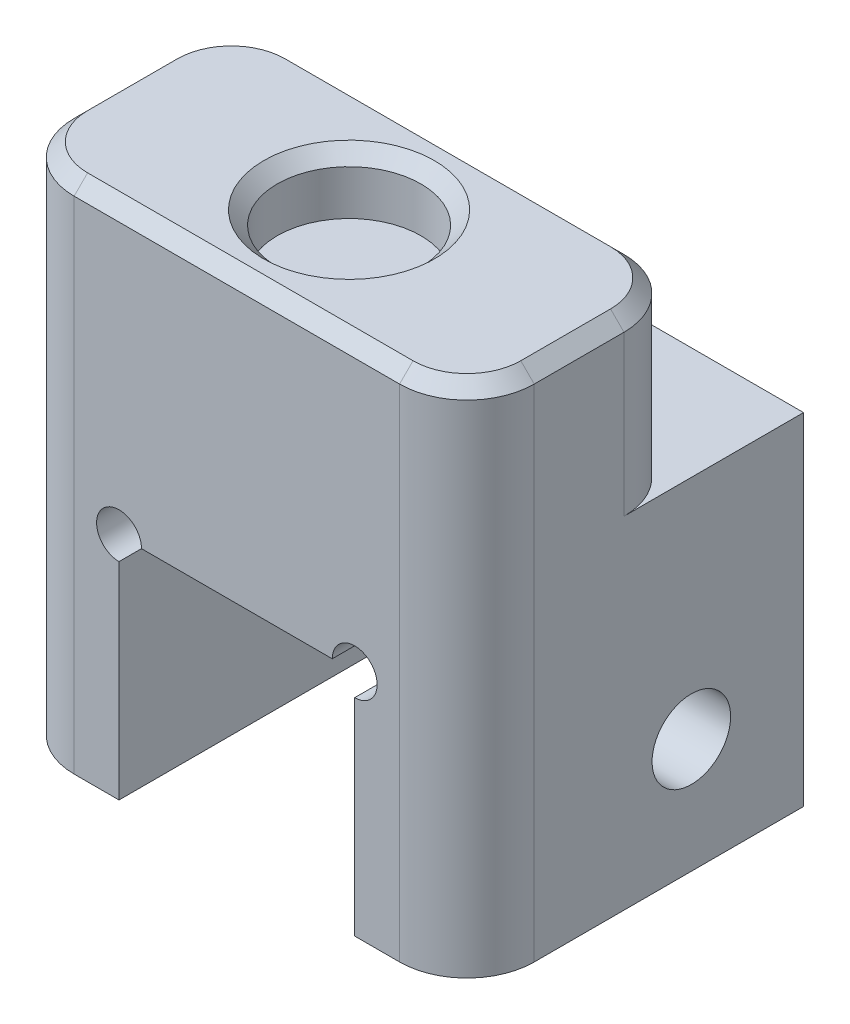
ISO-10303-21;
HEADER;
FILE_DESCRIPTION(('STEP AP214'),'2;1');
FILE_NAME('part.step','',(''),(''),'','','');
FILE_SCHEMA(('AUTOMOTIVE_DESIGN { 1 0 10303 214 1 1 1 1 }'));
ENDSEC;
DATA;
#1=APPLICATION_CONTEXT('core data for automotive mechanical design processes');
#2=APPLICATION_PROTOCOL_DEFINITION('international standard','automotive_design',2000,#1);
#3=PRODUCT_CONTEXT('',#1,'mechanical');
#4=PRODUCT('Part','Part','',(#3));
#5=PRODUCT_RELATED_PRODUCT_CATEGORY('part','',(#4));
#6=PRODUCT_DEFINITION_FORMATION('','',#4);
#7=PRODUCT_DEFINITION_CONTEXT('part definition',#1,'design');
#8=PRODUCT_DEFINITION('design','',#6,#7);
#9=PRODUCT_DEFINITION_SHAPE('','',#8);
#10=(LENGTH_UNIT() NAMED_UNIT(*) SI_UNIT(.MILLI.,.METRE.));
#11=(NAMED_UNIT(*) PLANE_ANGLE_UNIT() SI_UNIT($,.RADIAN.));
#12=(NAMED_UNIT(*) SI_UNIT($,.STERADIAN.) SOLID_ANGLE_UNIT());
#13=UNCERTAINTY_MEASURE_WITH_UNIT(LENGTH_MEASURE(1.E-05),#10,'distance_accuracy_value','');
#14=(GEOMETRIC_REPRESENTATION_CONTEXT(3) GLOBAL_UNCERTAINTY_ASSIGNED_CONTEXT((#13)) GLOBAL_UNIT_ASSIGNED_CONTEXT((#10,
#11,#12)) REPRESENTATION_CONTEXT('',''));
#15=CARTESIAN_POINT('',(0.,0.,0.));
#16=DIRECTION('',(0.,0.,1.));
#17=DIRECTION('',(1.,0.,0.));
#18=AXIS2_PLACEMENT_3D('',#15,#16,#17);
#19=CARTESIAN_POINT('',(0.,0.,0.));
#20=DIRECTION('',(0.,0.,1.));
#21=DIRECTION('',(1.,0.,0.));
#22=AXIS2_PLACEMENT_3D('',#19,#20,#21);
#23=PLANE('',#22);
#24=DIRECTION('',(0.,1.,0.));
#25=VECTOR('',#24,1.);
#26=CARTESIAN_POINT('',(-7.25000000000001,11.45,0.));
#27=LINE('',#26,#25);
#28=CARTESIAN_POINT('',(-7.25000000000001,3.75000000000001,0.));
#29=VERTEX_POINT('',#28);
#30=CARTESIAN_POINT('',(-7.25000000000001,10.85,0.));
#31=VERTEX_POINT('',#30);
#32=EDGE_CURVE('E286',#29,#31,#27,.T.);
#33=ORIENTED_EDGE('',*,*,#32,.T.);
#34=DIRECTION('',(1.,0.,0.));
#35=VECTOR('',#34,1.);
#36=CARTESIAN_POINT('',(7.25000000000001,10.85,0.));
#37=LINE('',#36,#35);
#38=CARTESIAN_POINT('',(7.25000000000001,10.85,0.));
#39=VERTEX_POINT('',#38);
#40=EDGE_CURVE('E54',#31,#39,#37,.T.);
#41=ORIENTED_EDGE('',*,*,#40,.T.);
#42=DIRECTION('',(0.,1.,0.));
#43=VECTOR('',#42,1.);
#44=CARTESIAN_POINT('',(7.25000000000001,0.,0.));
#45=LINE('',#44,#43);
#46=CARTESIAN_POINT('',(7.25000000000001,3.75000000000001,0.));
#47=VERTEX_POINT('',#46);
#48=EDGE_CURVE('E277',#39,#47,#45,.F.);
#49=ORIENTED_EDGE('',*,*,#48,.T.);
#50=DIRECTION('',(1.,0.,0.));
#51=VECTOR('',#50,1.);
#52=CARTESIAN_POINT('',(10.25,3.75,0.));
#53=LINE('',#52,#51);
#54=EDGE_CURVE('E236',#29,#47,#53,.T.);
#55=ORIENTED_EDGE('',*,*,#54,.F.);
#56=EDGE_LOOP('',(#33,#41,#49,#55));
#57=FACE_BOUND('',#56,.T.);
#58=ADVANCED_FACE('F43',(#57),#23,.F.);
#59=CARTESIAN_POINT('',(0.,-1.24999999999999,10.));
#60=DIRECTION('',(0.,1.,0.));
#61=DIRECTION('',(0.,0.,1.));
#62=AXIS2_PLACEMENT_3D('',#59,#60,#61);
#63=PLANE('',#62);
#64=DIRECTION('',(-1.,0.,0.));
#65=VECTOR('',#64,1.);
#66=CARTESIAN_POINT('',(-5.25,-1.24999999999999,-5.));
#67=LINE('',#66,#65);
#68=CARTESIAN_POINT('',(4.25000000000001,-1.24999999999999,-5.));
#69=VERTEX_POINT('',#68);
#70=CARTESIAN_POINT('',(-4.24999999999999,-1.24999999999999,-5.));
#71=VERTEX_POINT('',#70);
#72=EDGE_CURVE('E204',#69,#71,#67,.T.);
#73=ORIENTED_EDGE('',*,*,#72,.F.);
#74=DIRECTION('',(0.,0.,1.));
#75=VECTOR('',#74,1.);
#76=CARTESIAN_POINT('',(4.25000000000001,-1.24999999999999,-5.));
#77=LINE('',#76,#75);
#78=CARTESIAN_POINT('',(4.25000000000001,-1.24999999999999,10.));
#79=VERTEX_POINT('',#78);
#80=EDGE_CURVE('E428',#69,#79,#77,.T.);
#81=ORIENTED_EDGE('',*,*,#80,.T.);
#82=DIRECTION('',(1.,0.,0.));
#83=VECTOR('',#82,1.);
#84=CARTESIAN_POINT('',(0.,-1.24999999999999,10.));
#85=LINE('',#84,#83);
#86=CARTESIAN_POINT('',(-4.24999999999999,-1.24999999999999,10.));
#87=VERTEX_POINT('',#86);
#88=EDGE_CURVE('E206',#87,#79,#85,.T.);
#89=ORIENTED_EDGE('',*,*,#88,.F.);
#90=DIRECTION('',(0.,0.,1.));
#91=VECTOR('',#90,1.);
#92=CARTESIAN_POINT('',(-4.24999999999999,-1.24999999999999,-5.));
#93=LINE('',#92,#91);
#94=EDGE_CURVE('E188',#87,#71,#93,.F.);
#95=ORIENTED_EDGE('',*,*,#94,.T.);
#96=EDGE_LOOP('',(#73,#81,#89,#95));
#97=FACE_BOUND('',#96,.T.);
#98=ADVANCED_FACE('F202',(#97),#63,.F.);
#99=CARTESIAN_POINT('',(5.25000000000001,0.,10.));
#100=DIRECTION('',(1.,0.,0.));
#101=DIRECTION('',(0.,1.,0.));
#102=AXIS2_PLACEMENT_3D('',#99,#100,#101);
#103=PLANE('',#102);
#104=CARTESIAN_POINT('',(5.25000000000001,-6.34999999999999,0.));
#105=DIRECTION('',(1.,0.,0.));
#106=DIRECTION('',(0.,1.,0.));
#107=AXIS2_PLACEMENT_3D('',#104,#105,#106);
#108=CIRCLE('',#107,1.75);
#109=CARTESIAN_POINT('',(5.25000000000001,-4.59999999999999,0.));
#110=VERTEX_POINT('',#109);
#111=EDGE_CURVE('E282',#110,#110,#108,.T.);
#112=ORIENTED_EDGE('',*,*,#111,.T.);
#113=EDGE_LOOP('',(#112));
#114=FACE_BOUND('',#113,.T.);
#115=DIRECTION('',(0.,-1.,0.));
#116=VECTOR('',#115,1.);
#117=CARTESIAN_POINT('',(5.25000000000001,0.,10.));
#118=LINE('',#117,#116);
#119=CARTESIAN_POINT('',(5.25000000000001,-2.24999999999999,10.));
#120=VERTEX_POINT('',#119);
#121=CARTESIAN_POINT('',(5.25000000000001,-11.45,10.));
#122=VERTEX_POINT('',#121);
#123=EDGE_CURVE('E250',#120,#122,#118,.T.);
#124=ORIENTED_EDGE('',*,*,#123,.F.);
#125=DIRECTION('',(0.,0.,1.));
#126=VECTOR('',#125,1.);
#127=CARTESIAN_POINT('',(5.25000000000001,-2.24999999999999,-5.));
#128=LINE('',#127,#126);
#129=CARTESIAN_POINT('',(5.25000000000001,-2.24999999999999,-5.));
#130=VERTEX_POINT('',#129);
#131=EDGE_CURVE('E208',#120,#130,#128,.F.);
#132=ORIENTED_EDGE('',*,*,#131,.T.);
#133=DIRECTION('',(0.,1.,0.));
#134=VECTOR('',#133,1.);
#135=CARTESIAN_POINT('',(5.25000000000001,-1.24999999999999,-5.));
#136=LINE('',#135,#134);
#137=CARTESIAN_POINT('',(5.25000000000001,-11.45,-5.));
#138=VERTEX_POINT('',#137);
#139=EDGE_CURVE('E216',#138,#130,#136,.T.);
#140=ORIENTED_EDGE('',*,*,#139,.F.);
#141=DIRECTION('',(0.,0.,-1.));
#142=VECTOR('',#141,1.);
#143=CARTESIAN_POINT('',(5.25000000000001,-11.45,10.));
#144=LINE('',#143,#142);
#145=EDGE_CURVE('E272',#122,#138,#144,.T.);
#146=ORIENTED_EDGE('',*,*,#145,.F.);
#147=EDGE_LOOP('',(#124,#132,#140,#146));
#148=FACE_BOUND('',#147,.T.);
#149=ADVANCED_FACE('F446',(#114,#148),#103,.F.);
#150=CARTESIAN_POINT('',(0.,-11.45,10.));
#151=DIRECTION('',(0.,1.,0.));
#152=DIRECTION('',(-1.,0.,0.));
#153=AXIS2_PLACEMENT_3D('',#150,#151,#152);
#154=PLANE('',#153);
#155=DIRECTION('',(0.,0.,-1.));
#156=VECTOR('',#155,1.);
#157=CARTESIAN_POINT('',(10.25,-11.45,10.));
#158=LINE('',#157,#156);
#159=CARTESIAN_POINT('',(10.25,-11.45,7.));
#160=VERTEX_POINT('',#159);
#161=CARTESIAN_POINT('',(10.25,-11.45,-5.));
#162=VERTEX_POINT('',#161);
#163=EDGE_CURVE('E269',#160,#162,#158,.T.);
#164=ORIENTED_EDGE('',*,*,#163,.F.);
#165=CARTESIAN_POINT('',(7.25000000000001,-11.45,7.));
#166=DIRECTION('',(0.,1.,0.));
#167=DIRECTION('',(-1.,0.,0.));
#168=AXIS2_PLACEMENT_3D('',#165,#166,#167);
#169=CIRCLE('',#168,3.);
#170=CARTESIAN_POINT('',(7.25000000000001,-11.45,10.));
#171=VERTEX_POINT('',#170);
#172=EDGE_CURVE('E312',#160,#171,#169,.F.);
#173=ORIENTED_EDGE('',*,*,#172,.T.);
#174=DIRECTION('',(1.,0.,0.));
#175=VECTOR('',#174,1.);
#176=CARTESIAN_POINT('',(0.,-11.45,10.));
#177=LINE('',#176,#175);
#178=EDGE_CURVE('E253',#122,#171,#177,.T.);
#179=ORIENTED_EDGE('',*,*,#178,.F.);
#180=ORIENTED_EDGE('',*,*,#145,.T.);
#181=DIRECTION('',(-1.,0.,0.));
#182=VECTOR('',#181,1.);
#183=CARTESIAN_POINT('',(5.25000000000001,-11.45,-5.));
#184=LINE('',#183,#182);
#185=EDGE_CURVE('E222',#162,#138,#184,.T.);
#186=ORIENTED_EDGE('',*,*,#185,.F.);
#187=EDGE_LOOP('',(#164,#173,#179,#180,#186));
#188=FACE_BOUND('',#187,.T.);
#189=ADVANCED_FACE('F475',(#188),#154,.F.);
#190=CARTESIAN_POINT('',(10.25,0.,10.));
#191=DIRECTION('',(-1.,0.,0.));
#192=DIRECTION('',(0.,-1.,0.));
#193=AXIS2_PLACEMENT_3D('',#190,#191,#192);
#194=PLANE('',#193);
#195=CARTESIAN_POINT('',(10.25,-6.34999999999999,0.));
#196=DIRECTION('',(1.,0.,0.));
#197=DIRECTION('',(0.,1.,0.));
#198=AXIS2_PLACEMENT_3D('',#195,#196,#197);
#199=CIRCLE('',#198,1.75);
#200=CARTESIAN_POINT('',(10.25,-4.59999999999999,0.));
#201=VERTEX_POINT('',#200);
#202=EDGE_CURVE('E402',#201,#201,#199,.T.);
#203=ORIENTED_EDGE('',*,*,#202,.F.);
#204=EDGE_LOOP('',(#203));
#205=FACE_BOUND('',#204,.T.);
#206=DIRECTION('',(0.,1.,0.));
#207=VECTOR('',#206,1.);
#208=CARTESIAN_POINT('',(10.25,0.,3.));
#209=LINE('',#208,#207);
#210=CARTESIAN_POINT('',(10.25,3.75,3.));
#211=VERTEX_POINT('',#210);
#212=CARTESIAN_POINT('',(10.25,10.85,3.));
#213=VERTEX_POINT('',#212);
#214=EDGE_CURVE('E308',#211,#213,#209,.T.);
#215=ORIENTED_EDGE('',*,*,#214,.T.);
#216=DIRECTION('',(0.,0.,1.));
#217=VECTOR('',#216,1.);
#218=CARTESIAN_POINT('',(10.25,10.85,7.));
#219=LINE('',#218,#217);
#220=CARTESIAN_POINT('',(10.25,10.85,7.));
#221=VERTEX_POINT('',#220);
#222=EDGE_CURVE('E355',#213,#221,#219,.T.);
#223=ORIENTED_EDGE('',*,*,#222,.T.);
#224=DIRECTION('',(0.,1.,0.));
#225=VECTOR('',#224,1.);
#226=CARTESIAN_POINT('',(10.25,-11.45,7.));
#227=LINE('',#226,#225);
#228=EDGE_CURVE('E305',#221,#160,#227,.F.);
#229=ORIENTED_EDGE('',*,*,#228,.T.);
#230=ORIENTED_EDGE('',*,*,#163,.T.);
#231=DIRECTION('',(0.,-1.,0.));
#232=VECTOR('',#231,1.);
#233=CARTESIAN_POINT('',(10.25,-11.45,-5.));
#234=LINE('',#233,#232);
#235=CARTESIAN_POINT('',(10.25,3.75,-5.));
#236=VERTEX_POINT('',#235);
#237=EDGE_CURVE('E240',#236,#162,#234,.T.);
#238=ORIENTED_EDGE('',*,*,#237,.F.);
#239=DIRECTION('',(0.,0.,1.));
#240=VECTOR('',#239,1.);
#241=CARTESIAN_POINT('',(10.25,3.75,-5.));
#242=LINE('',#241,#240);
#243=EDGE_CURVE('E235',#236,#211,#242,.T.);
#244=ORIENTED_EDGE('',*,*,#243,.T.);
#245=EDGE_LOOP('',(#215,#223,#229,#230,#238,#244));
#246=FACE_BOUND('',#245,.T.);
#247=ADVANCED_FACE('F472',(#205,#246),#194,.F.);
#248=CARTESIAN_POINT('',(0.,11.45,10.));
#249=DIRECTION('',(0.,1.,0.));
#250=DIRECTION('',(-1.,0.,0.));
#251=AXIS2_PLACEMENT_3D('',#248,#249,#250);
#252=PLANE('',#251);
#253=DIRECTION('',(0.,0.,-1.));
#254=VECTOR('',#253,1.);
#255=CARTESIAN_POINT('',(9.65000000000002,11.45,3.));
#256=LINE('',#255,#254);
#257=CARTESIAN_POINT('',(9.65000000000002,11.45,7.));
#258=VERTEX_POINT('',#257);
#259=CARTESIAN_POINT('',(9.65000000000002,11.45,3.));
#260=VERTEX_POINT('',#259);
#261=EDGE_CURVE('E344',#258,#260,#256,.T.);
#262=ORIENTED_EDGE('',*,*,#261,.T.);
#263=CARTESIAN_POINT('',(7.25000000000001,11.45,3.));
#264=DIRECTION('',(0.,1.,0.));
#265=DIRECTION('',(-1.,0.,0.));
#266=AXIS2_PLACEMENT_3D('',#263,#264,#265);
#267=CIRCLE('',#266,2.4);
#268=CARTESIAN_POINT('',(7.25000000000001,11.45,0.599999999999996));
#269=VERTEX_POINT('',#268);
#270=EDGE_CURVE('E347',#260,#269,#267,.T.);
#271=ORIENTED_EDGE('',*,*,#270,.T.);
#272=DIRECTION('',(-1.,0.,0.));
#273=VECTOR('',#272,1.);
#274=CARTESIAN_POINT('',(-7.25000000000001,11.45,0.599999999999996));
#275=LINE('',#274,#273);
#276=CARTESIAN_POINT('',(-7.25000000000001,11.45,0.599999999999996));
#277=VERTEX_POINT('',#276);
#278=EDGE_CURVE('E326',#269,#277,#275,.T.);
#279=ORIENTED_EDGE('',*,*,#278,.T.);
#280=CARTESIAN_POINT('',(-7.25000000000001,11.45,3.));
#281=DIRECTION('',(0.,1.,0.));
#282=DIRECTION('',(-1.,0.,0.));
#283=AXIS2_PLACEMENT_3D('',#280,#281,#282);
#284=CIRCLE('',#283,2.4);
#285=CARTESIAN_POINT('',(-9.65000000000001,11.45,3.));
#286=VERTEX_POINT('',#285);
#287=EDGE_CURVE('E329',#277,#286,#284,.T.);
#288=ORIENTED_EDGE('',*,*,#287,.T.);
#289=DIRECTION('',(0.,0.,1.));
#290=VECTOR('',#289,1.);
#291=CARTESIAN_POINT('',(-9.65000000000001,11.45,10.));
#292=LINE('',#291,#290);
#293=CARTESIAN_POINT('',(-9.65000000000001,11.45,7.));
#294=VERTEX_POINT('',#293);
#295=EDGE_CURVE('E332',#286,#294,#292,.T.);
#296=ORIENTED_EDGE('',*,*,#295,.T.);
#297=CARTESIAN_POINT('',(-7.25000000000001,11.45,7.));
#298=DIRECTION('',(0.,1.,0.));
#299=DIRECTION('',(-1.,0.,0.));
#300=AXIS2_PLACEMENT_3D('',#297,#298,#299);
#301=CIRCLE('',#300,2.4);
#302=CARTESIAN_POINT('',(-7.25000000000001,11.45,9.4));
#303=VERTEX_POINT('',#302);
#304=EDGE_CURVE('E335',#294,#303,#301,.T.);
#305=ORIENTED_EDGE('',*,*,#304,.T.);
#306=DIRECTION('',(1.,0.,0.));
#307=VECTOR('',#306,1.);
#308=CARTESIAN_POINT('',(0.,11.45,9.4));
#309=LINE('',#308,#307);
#310=CARTESIAN_POINT('',(7.25000000000001,11.45,9.4));
#311=VERTEX_POINT('',#310);
#312=EDGE_CURVE('E338',#303,#311,#309,.T.);
#313=ORIENTED_EDGE('',*,*,#312,.T.);
#314=CARTESIAN_POINT('',(7.25000000000001,11.45,7.));
#315=DIRECTION('',(0.,1.,0.));
#316=DIRECTION('',(-1.,0.,0.));
#317=AXIS2_PLACEMENT_3D('',#314,#315,#316);
#318=CIRCLE('',#317,2.4);
#319=EDGE_CURVE('E341',#311,#258,#318,.T.);
#320=ORIENTED_EDGE('',*,*,#319,.T.);
#321=EDGE_LOOP('',(#262,#271,#279,#288,#296,#305,#313,#320));
#322=FACE_BOUND('',#321,.T.);
#323=CARTESIAN_POINT('',(0.,11.45,5.));
#324=DIRECTION('',(0.,1.,0.));
#325=DIRECTION('',(-1.,0.,0.));
#326=AXIS2_PLACEMENT_3D('',#323,#324,#325);
#327=CIRCLE('',#326,3.8);
#328=CARTESIAN_POINT('',(-3.8,11.45,5.));
#329=VERTEX_POINT('',#328);
#330=EDGE_CURVE('E322',#329,#329,#327,.F.);
#331=ORIENTED_EDGE('',*,*,#330,.T.);
#332=EDGE_LOOP('',(#331));
#333=FACE_BOUND('',#332,.T.);
#334=ADVANCED_FACE('F489',(#322,#333),#252,.T.);
#335=CARTESIAN_POINT('',(-10.25,0.,10.));
#336=DIRECTION('',(-1.,0.,0.));
#337=DIRECTION('',(0.,-1.,0.));
#338=AXIS2_PLACEMENT_3D('',#335,#336,#337);
#339=PLANE('',#338);
#340=CARTESIAN_POINT('',(-10.25,-6.34999999999999,0.));
#341=DIRECTION('',(1.,0.,0.));
#342=DIRECTION('',(0.,1.,0.));
#343=AXIS2_PLACEMENT_3D('',#340,#341,#342);
#344=CIRCLE('',#343,1.75);
#345=CARTESIAN_POINT('',(-10.25,-4.59999999999999,0.));
#346=VERTEX_POINT('',#345);
#347=EDGE_CURVE('E283',#346,#346,#344,.T.);
#348=ORIENTED_EDGE('',*,*,#347,.T.);
#349=EDGE_LOOP('',(#348));
#350=FACE_BOUND('',#349,.T.);
#351=DIRECTION('',(0.,1.,0.));
#352=VECTOR('',#351,1.);
#353=CARTESIAN_POINT('',(-10.25,0.,7.));
#354=LINE('',#353,#352);
#355=CARTESIAN_POINT('',(-10.25,-11.45,7.));
#356=VERTEX_POINT('',#355);
#357=CARTESIAN_POINT('',(-10.25,10.85,7.));
#358=VERTEX_POINT('',#357);
#359=EDGE_CURVE('E289',#356,#358,#354,.T.);
#360=ORIENTED_EDGE('',*,*,#359,.T.);
#361=DIRECTION('',(0.,0.,-1.));
#362=VECTOR('',#361,1.);
#363=CARTESIAN_POINT('',(-10.25,10.85,10.));
#364=LINE('',#363,#362);
#365=CARTESIAN_POINT('',(-10.25,10.85,3.));
#366=VERTEX_POINT('',#365);
#367=EDGE_CURVE('E70',#358,#366,#364,.T.);
#368=ORIENTED_EDGE('',*,*,#367,.T.);
#369=DIRECTION('',(0.,1.,0.));
#370=VECTOR('',#369,1.);
#371=CARTESIAN_POINT('',(-10.25,3.75000000000001,3.));
#372=LINE('',#371,#370);
#373=CARTESIAN_POINT('',(-10.25,3.75000000000001,3.));
#374=VERTEX_POINT('',#373);
#375=EDGE_CURVE('E292',#366,#374,#372,.F.);
#376=ORIENTED_EDGE('',*,*,#375,.T.);
#377=DIRECTION('',(0.,0.,1.));
#378=VECTOR('',#377,1.);
#379=CARTESIAN_POINT('',(-10.25,3.75000000000001,-5.));
#380=LINE('',#379,#378);
#381=CARTESIAN_POINT('',(-10.25,3.75000000000001,-5.));
#382=VERTEX_POINT('',#381);
#383=EDGE_CURVE('E244',#382,#374,#380,.T.);
#384=ORIENTED_EDGE('',*,*,#383,.F.);
#385=DIRECTION('',(0.,1.,0.));
#386=VECTOR('',#385,1.);
#387=CARTESIAN_POINT('',(-10.25,3.75000000000001,-5.));
#388=LINE('',#387,#386);
#389=CARTESIAN_POINT('',(-10.25,-11.45,-5.));
#390=VERTEX_POINT('',#389);
#391=EDGE_CURVE('E229',#390,#382,#388,.T.);
#392=ORIENTED_EDGE('',*,*,#391,.F.);
#393=DIRECTION('',(0.,0.,-1.));
#394=VECTOR('',#393,1.);
#395=CARTESIAN_POINT('',(-10.25,-11.45,10.));
#396=LINE('',#395,#394);
#397=EDGE_CURVE('E266',#356,#390,#396,.T.);
#398=ORIENTED_EDGE('',*,*,#397,.F.);
#399=EDGE_LOOP('',(#360,#368,#376,#384,#392,#398));
#400=FACE_BOUND('',#399,.T.);
#401=ADVANCED_FACE('F462',(#350,#400),#339,.T.);
#402=CARTESIAN_POINT('',(-7.25,-11.45,10.));
#403=VERTEX_POINT('',#402);
#404=CARTESIAN_POINT('',(-5.24999999999999,-11.45,10.));
#405=VERTEX_POINT('',#404);
#406=EDGE_CURVE('E257',#403,#405,#177,.T.);
#407=ORIENTED_EDGE('',*,*,#406,.F.);
#408=CARTESIAN_POINT('',(-7.25,-11.45,7.));
#409=DIRECTION('',(0.,1.,0.));
#410=DIRECTION('',(-1.,0.,0.));
#411=AXIS2_PLACEMENT_3D('',#408,#409,#410);
#412=CIRCLE('',#411,3.);
#413=EDGE_CURVE('E302',#403,#356,#412,.F.);
#414=ORIENTED_EDGE('',*,*,#413,.T.);
#415=ORIENTED_EDGE('',*,*,#397,.T.);
#416=DIRECTION('',(-1.,0.,0.));
#417=VECTOR('',#416,1.);
#418=CARTESIAN_POINT('',(-10.25,-11.45,-5.));
#419=LINE('',#418,#417);
#420=CARTESIAN_POINT('',(-5.24999999999999,-11.45,-5.));
#421=VERTEX_POINT('',#420);
#422=EDGE_CURVE('E220',#421,#390,#419,.T.);
#423=ORIENTED_EDGE('',*,*,#422,.F.);
#424=DIRECTION('',(0.,0.,-1.));
#425=VECTOR('',#424,1.);
#426=CARTESIAN_POINT('',(-5.24999999999999,-11.45,10.));
#427=LINE('',#426,#425);
#428=EDGE_CURVE('E262',#405,#421,#427,.T.);
#429=ORIENTED_EDGE('',*,*,#428,.F.);
#430=EDGE_LOOP('',(#407,#414,#415,#423,#429));
#431=FACE_BOUND('',#430,.T.);
#432=ADVANCED_FACE('F500',(#431),#154,.F.);
#433=CARTESIAN_POINT('',(-5.25,0.,10.));
#434=DIRECTION('',(1.,0.,0.));
#435=DIRECTION('',(0.,1.,0.));
#436=AXIS2_PLACEMENT_3D('',#433,#434,#435);
#437=PLANE('',#436);
#438=CARTESIAN_POINT('',(-5.24999999999999,-6.34999999999999,0.));
#439=DIRECTION('',(1.,0.,0.));
#440=DIRECTION('',(0.,1.,0.));
#441=AXIS2_PLACEMENT_3D('',#438,#439,#440);
#442=CIRCLE('',#441,1.75);
#443=CARTESIAN_POINT('',(-5.24999999999999,-4.59999999999999,0.));
#444=VERTEX_POINT('',#443);
#445=EDGE_CURVE('E278',#444,#444,#442,.T.);
#446=ORIENTED_EDGE('',*,*,#445,.F.);
#447=EDGE_LOOP('',(#446));
#448=FACE_BOUND('',#447,.T.);
#449=DIRECTION('',(0.,0.,1.));
#450=VECTOR('',#449,1.);
#451=CARTESIAN_POINT('',(-5.25,-2.24999999999999,-5.));
#452=LINE('',#451,#450);
#453=CARTESIAN_POINT('',(-5.25,-2.24999999999999,10.));
#454=VERTEX_POINT('',#453);
#455=CARTESIAN_POINT('',(-5.25,-2.24999999999999,-5.));
#456=VERTEX_POINT('',#455);
#457=EDGE_CURVE('E191',#454,#456,#452,.F.);
#458=ORIENTED_EDGE('',*,*,#457,.F.);
#459=DIRECTION('',(0.,-1.,0.));
#460=VECTOR('',#459,1.);
#461=CARTESIAN_POINT('',(-5.25,0.,10.));
#462=LINE('',#461,#460);
#463=EDGE_CURVE('E258',#454,#405,#462,.T.);
#464=ORIENTED_EDGE('',*,*,#463,.T.);
#465=ORIENTED_EDGE('',*,*,#428,.T.);
#466=DIRECTION('',(0.,-1.,0.));
#467=VECTOR('',#466,1.);
#468=CARTESIAN_POINT('',(-5.24999999999999,-11.45,-5.));
#469=LINE('',#468,#467);
#470=EDGE_CURVE('E215',#456,#421,#469,.T.);
#471=ORIENTED_EDGE('',*,*,#470,.F.);
#472=EDGE_LOOP('',(#458,#464,#465,#471));
#473=FACE_BOUND('',#472,.T.);
#474=ADVANCED_FACE('F455',(#448,#473),#437,.T.);
#475=CARTESIAN_POINT('',(0.,0.,10.));
#476=DIRECTION('',(0.,0.,1.));
#477=DIRECTION('',(1.,0.,0.));
#478=AXIS2_PLACEMENT_3D('',#475,#476,#477);
#479=PLANE('',#478);
#480=DIRECTION('',(0.,1.,0.));
#481=VECTOR('',#480,1.);
#482=CARTESIAN_POINT('',(7.25000000000001,11.45,10.));
#483=LINE('',#482,#481);
#484=CARTESIAN_POINT('',(7.25000000000001,10.85,10.));
#485=VERTEX_POINT('',#484);
#486=EDGE_CURVE('E295',#171,#485,#483,.T.);
#487=ORIENTED_EDGE('',*,*,#486,.T.);
#488=DIRECTION('',(-1.,0.,0.));
#489=VECTOR('',#488,1.);
#490=CARTESIAN_POINT('',(0.,10.85,10.));
#491=LINE('',#490,#489);
#492=CARTESIAN_POINT('',(-7.25000000000001,10.85,10.));
#493=VERTEX_POINT('',#492);
#494=EDGE_CURVE('E361',#485,#493,#491,.T.);
#495=ORIENTED_EDGE('',*,*,#494,.T.);
#496=DIRECTION('',(0.,1.,0.));
#497=VECTOR('',#496,1.);
#498=CARTESIAN_POINT('',(-7.25000000000001,0.,10.));
#499=LINE('',#498,#497);
#500=EDGE_CURVE('E299',#493,#403,#499,.F.);
#501=ORIENTED_EDGE('',*,*,#500,.T.);
#502=ORIENTED_EDGE('',*,*,#406,.T.);
#503=ORIENTED_EDGE('',*,*,#463,.F.);
#504=CARTESIAN_POINT('',(-5.25,-1.24999999999999,10.));
#505=DIRECTION('',(0.,0.,1.));
#506=DIRECTION('',(1.,0.,0.));
#507=AXIS2_PLACEMENT_3D('',#504,#505,#506);
#508=CIRCLE('',#507,1.);
#509=EDGE_CURVE('E197',#87,#454,#508,.T.);
#510=ORIENTED_EDGE('',*,*,#509,.F.);
#511=ORIENTED_EDGE('',*,*,#88,.T.);
#512=CARTESIAN_POINT('',(5.25000000000001,-1.24999999999999,10.));
#513=DIRECTION('',(0.,0.,1.));
#514=DIRECTION('',(1.,0.,0.));
#515=AXIS2_PLACEMENT_3D('',#512,#513,#514);
#516=CIRCLE('',#515,1.);
#517=EDGE_CURVE('E196',#120,#79,#516,.T.);
#518=ORIENTED_EDGE('',*,*,#517,.F.);
#519=ORIENTED_EDGE('',*,*,#123,.T.);
#520=ORIENTED_EDGE('',*,*,#178,.T.);
#521=EDGE_LOOP('',(#487,#495,#501,#502,#503,#510,#511,#518,#519,#520));
#522=FACE_BOUND('',#521,.T.);
#523=ADVANCED_FACE('F452',(#522),#479,.T.);
#524=CARTESIAN_POINT('',(10.25,3.75,-5.));
#525=DIRECTION('',(0.,-1.,0.));
#526=DIRECTION('',(1.,0.,0.));
#527=AXIS2_PLACEMENT_3D('',#524,#525,#526);
#528=PLANE('',#527);
#529=ORIENTED_EDGE('',*,*,#383,.T.);
#530=CARTESIAN_POINT('',(-7.25000000000001,3.75000000000001,3.));
#531=DIRECTION('',(0.,-1.,0.));
#532=DIRECTION('',(1.,0.,0.));
#533=AXIS2_PLACEMENT_3D('',#530,#531,#532);
#534=CIRCLE('',#533,3.);
#535=EDGE_CURVE('E315',#374,#29,#534,.T.);
#536=ORIENTED_EDGE('',*,*,#535,.T.);
#537=ORIENTED_EDGE('',*,*,#54,.T.);
#538=CARTESIAN_POINT('',(7.25000000000001,3.75000000000001,3.));
#539=DIRECTION('',(0.,-1.,0.));
#540=DIRECTION('',(1.,0.,0.));
#541=AXIS2_PLACEMENT_3D('',#538,#539,#540);
#542=CIRCLE('',#541,3.);
#543=EDGE_CURVE('E318',#47,#211,#542,.T.);
#544=ORIENTED_EDGE('',*,*,#543,.T.);
#545=ORIENTED_EDGE('',*,*,#243,.F.);
#546=DIRECTION('',(1.,0.,0.));
#547=VECTOR('',#546,1.);
#548=CARTESIAN_POINT('',(10.25,3.75,-5.));
#549=LINE('',#548,#547);
#550=EDGE_CURVE('E232',#382,#236,#549,.T.);
#551=ORIENTED_EDGE('',*,*,#550,.F.);
#552=EDGE_LOOP('',(#529,#536,#537,#544,#545,#551));
#553=FACE_BOUND('',#552,.T.);
#554=ADVANCED_FACE('F468',(#553),#528,.F.);
#555=CARTESIAN_POINT('',(0.,0.,-5.));
#556=DIRECTION('',(0.,0.,1.));
#557=DIRECTION('',(1.,0.,0.));
#558=AXIS2_PLACEMENT_3D('',#555,#556,#557);
#559=PLANE('',#558);
#560=ORIENTED_EDGE('',*,*,#139,.T.);
#561=CARTESIAN_POINT('',(5.25000000000001,-1.24999999999999,-5.));
#562=DIRECTION('',(0.,0.,1.));
#563=DIRECTION('',(1.,0.,0.));
#564=AXIS2_PLACEMENT_3D('',#561,#562,#563);
#565=CIRCLE('',#564,1.);
#566=EDGE_CURVE('E213',#130,#69,#565,.T.);
#567=ORIENTED_EDGE('',*,*,#566,.T.);
#568=ORIENTED_EDGE('',*,*,#72,.T.);
#569=CARTESIAN_POINT('',(-5.25,-1.24999999999999,-5.));
#570=DIRECTION('',(0.,0.,1.));
#571=DIRECTION('',(1.,0.,0.));
#572=AXIS2_PLACEMENT_3D('',#569,#570,#571);
#573=CIRCLE('',#572,1.);
#574=EDGE_CURVE('E185',#71,#456,#573,.T.);
#575=ORIENTED_EDGE('',*,*,#574,.T.);
#576=ORIENTED_EDGE('',*,*,#470,.T.);
#577=ORIENTED_EDGE('',*,*,#422,.T.);
#578=ORIENTED_EDGE('',*,*,#391,.T.);
#579=ORIENTED_EDGE('',*,*,#550,.T.);
#580=ORIENTED_EDGE('',*,*,#237,.T.);
#581=ORIENTED_EDGE('',*,*,#185,.T.);
#582=EDGE_LOOP('',(#560,#567,#568,#575,#576,#577,#578,#579,#580,#581));
#583=FACE_BOUND('',#582,.T.);
#584=ADVANCED_FACE('F212',(#583),#559,.F.);
#585=CARTESIAN_POINT('',(0.,8.85000000000001,5.));
#586=DIRECTION('',(0.,1.,0.));
#587=DIRECTION('',(-1.,0.,0.));
#588=AXIS2_PLACEMENT_3D('',#585,#586,#587);
#589=CYLINDRICAL_SURFACE('',#588,3.2);
#590=CARTESIAN_POINT('',(0.,10.85,5.));
#591=DIRECTION('',(0.,1.,0.));
#592=DIRECTION('',(-1.,0.,0.));
#593=AXIS2_PLACEMENT_3D('',#590,#591,#592);
#594=CIRCLE('',#593,3.2);
#595=CARTESIAN_POINT('',(-3.2,10.85,5.));
#596=VERTEX_POINT('',#595);
#597=EDGE_CURVE('E11',#596,#596,#594,.T.);
#598=ORIENTED_EDGE('',*,*,#597,.T.);
#599=EDGE_LOOP('',(#598));
#600=FACE_BOUND('',#599,.T.);
#601=CARTESIAN_POINT('',(0.,8.85000000000001,5.));
#602=DIRECTION('',(0.,1.,0.));
#603=DIRECTION('',(-1.,0.,0.));
#604=AXIS2_PLACEMENT_3D('',#601,#602,#603);
#605=CIRCLE('',#604,3.2);
#606=CARTESIAN_POINT('',(-3.2,8.85000000000001,5.));
#607=VERTEX_POINT('',#606);
#608=EDGE_CURVE('E241',#607,#607,#605,.T.);
#609=ORIENTED_EDGE('',*,*,#608,.F.);
#610=EDGE_LOOP('',(#609));
#611=FACE_BOUND('',#610,.T.);
#612=ADVANCED_FACE('F527',(#600,#611),#589,.F.);
#613=CARTESIAN_POINT('',(0.,8.85000000000001,5.));
#614=DIRECTION('',(0.,1.,0.));
#615=DIRECTION('',(-1.,0.,0.));
#616=AXIS2_PLACEMENT_3D('',#613,#614,#615);
#617=PLANE('',#616);
#618=ORIENTED_EDGE('',*,*,#608,.T.);
#619=EDGE_LOOP('',(#618));
#620=FACE_BOUND('',#619,.T.);
#621=ADVANCED_FACE('F530',(#620),#617,.T.);
#622=CARTESIAN_POINT('',(-5.25,-1.24999999999999,-5.));
#623=DIRECTION('',(0.,0.,1.));
#624=DIRECTION('',(1.,0.,0.));
#625=AXIS2_PLACEMENT_3D('',#622,#623,#624);
#626=CYLINDRICAL_SURFACE('',#625,1.);
#627=ORIENTED_EDGE('',*,*,#509,.T.);
#628=ORIENTED_EDGE('',*,*,#457,.T.);
#629=ORIENTED_EDGE('',*,*,#574,.F.);
#630=ORIENTED_EDGE('',*,*,#94,.F.);
#631=EDGE_LOOP('',(#627,#628,#629,#630));
#632=FACE_BOUND('',#631,.T.);
#633=ADVANCED_FACE('F187',(#632),#626,.F.);
#634=CARTESIAN_POINT('',(5.25000000000001,-1.24999999999999,-5.));
#635=DIRECTION('',(0.,0.,1.));
#636=DIRECTION('',(1.,0.,0.));
#637=AXIS2_PLACEMENT_3D('',#634,#635,#636);
#638=CYLINDRICAL_SURFACE('',#637,1.);
#639=ORIENTED_EDGE('',*,*,#566,.F.);
#640=ORIENTED_EDGE('',*,*,#131,.F.);
#641=ORIENTED_EDGE('',*,*,#517,.T.);
#642=ORIENTED_EDGE('',*,*,#80,.F.);
#643=EDGE_LOOP('',(#639,#640,#641,#642));
#644=FACE_BOUND('',#643,.T.);
#645=ADVANCED_FACE('F450',(#644),#638,.F.);
#646=CARTESIAN_POINT('',(-10.25,-6.34999999999999,0.));
#647=DIRECTION('',(1.,0.,0.));
#648=DIRECTION('',(0.,1.,0.));
#649=AXIS2_PLACEMENT_3D('',#646,#647,#648);
#650=CYLINDRICAL_SURFACE('',#649,1.75);
#651=CARTESIAN_POINT('',(-5.24999999999999,-4.59999999999999,0.));
#652=CARTESIAN_POINT('',(-5.30208333333333,-4.59999999999999,0.));
#653=CARTESIAN_POINT('',(-5.35416666666666,-4.59999999999999,0.));
#654=CARTESIAN_POINT('',(-5.45833333333333,-4.59999999999999,0.));
#655=CARTESIAN_POINT('',(-5.51041666666666,-4.59999999999999,0.));
#656=CARTESIAN_POINT('',(-5.61458333333333,-4.59999999999999,0.));
#657=CARTESIAN_POINT('',(-5.66666666666666,-4.59999999999999,0.));
#658=CARTESIAN_POINT('',(-5.77083333333333,-4.59999999999999,0.));
#659=CARTESIAN_POINT('',(-5.82291666666666,-4.59999999999999,0.));
#660=CARTESIAN_POINT('',(-5.92708333333333,-4.59999999999999,0.));
#661=CARTESIAN_POINT('',(-5.97916666666666,-4.59999999999999,0.));
#662=CARTESIAN_POINT('',(-6.08333333333333,-4.59999999999999,0.));
#663=CARTESIAN_POINT('',(-6.13541666666666,-4.59999999999999,0.));
#664=CARTESIAN_POINT('',(-6.23958333333333,-4.59999999999999,0.));
#665=CARTESIAN_POINT('',(-6.29166666666666,-4.59999999999999,0.));
#666=CARTESIAN_POINT('',(-6.39583333333333,-4.59999999999999,0.));
#667=CARTESIAN_POINT('',(-6.44791666666666,-4.59999999999999,0.));
#668=CARTESIAN_POINT('',(-6.55208333333333,-4.59999999999999,0.));
#669=CARTESIAN_POINT('',(-6.60416666666667,-4.59999999999999,0.));
#670=CARTESIAN_POINT('',(-6.70833333333333,-4.59999999999999,0.));
#671=CARTESIAN_POINT('',(-6.76041666666667,-4.59999999999999,0.));
#672=CARTESIAN_POINT('',(-6.86458333333333,-4.59999999999999,0.));
#673=CARTESIAN_POINT('',(-6.91666666666667,-4.59999999999999,0.));
#674=CARTESIAN_POINT('',(-7.02083333333333,-4.59999999999999,0.));
#675=CARTESIAN_POINT('',(-7.07291666666667,-4.59999999999999,0.));
#676=CARTESIAN_POINT('',(-7.17708333333333,-4.59999999999999,0.));
#677=CARTESIAN_POINT('',(-7.22916666666667,-4.59999999999999,0.));
#678=CARTESIAN_POINT('',(-7.33333333333333,-4.59999999999999,0.));
#679=CARTESIAN_POINT('',(-7.38541666666667,-4.59999999999999,0.));
#680=CARTESIAN_POINT('',(-7.48958333333333,-4.59999999999999,0.));
#681=CARTESIAN_POINT('',(-7.54166666666667,-4.59999999999999,0.));
#682=CARTESIAN_POINT('',(-7.64583333333333,-4.59999999999999,0.));
#683=CARTESIAN_POINT('',(-7.69791666666667,-4.59999999999999,0.));
#684=CARTESIAN_POINT('',(-7.80208333333334,-4.59999999999999,0.));
#685=CARTESIAN_POINT('',(-7.85416666666667,-4.59999999999999,0.));
#686=CARTESIAN_POINT('',(-7.95833333333334,-4.59999999999999,0.));
#687=CARTESIAN_POINT('',(-8.01041666666667,-4.59999999999999,0.));
#688=CARTESIAN_POINT('',(-8.11458333333334,-4.59999999999999,0.));
#689=CARTESIAN_POINT('',(-8.16666666666667,-4.59999999999999,0.));
#690=CARTESIAN_POINT('',(-8.27083333333334,-4.59999999999999,0.));
#691=CARTESIAN_POINT('',(-8.32291666666667,-4.59999999999999,0.));
#692=CARTESIAN_POINT('',(-8.42708333333334,-4.59999999999999,0.));
#693=CARTESIAN_POINT('',(-8.47916666666667,-4.59999999999999,0.));
#694=CARTESIAN_POINT('',(-8.58333333333334,-4.59999999999999,0.));
#695=CARTESIAN_POINT('',(-8.63541666666667,-4.59999999999999,0.));
#696=CARTESIAN_POINT('',(-8.73958333333334,-4.59999999999999,0.));
#697=CARTESIAN_POINT('',(-8.79166666666667,-4.59999999999999,0.));
#698=CARTESIAN_POINT('',(-8.89583333333334,-4.59999999999999,0.));
#699=CARTESIAN_POINT('',(-8.94791666666667,-4.59999999999999,0.));
#700=CARTESIAN_POINT('',(-9.05208333333334,-4.59999999999999,0.));
#701=CARTESIAN_POINT('',(-9.10416666666667,-4.59999999999999,0.));
#702=CARTESIAN_POINT('',(-9.20833333333334,-4.59999999999999,0.));
#703=CARTESIAN_POINT('',(-9.26041666666667,-4.59999999999999,0.));
#704=CARTESIAN_POINT('',(-9.36458333333334,-4.59999999999999,0.));
#705=CARTESIAN_POINT('',(-9.41666666666667,-4.59999999999999,0.));
#706=CARTESIAN_POINT('',(-9.52083333333334,-4.59999999999999,0.));
#707=CARTESIAN_POINT('',(-9.57291666666667,-4.59999999999999,0.));
#708=CARTESIAN_POINT('',(-9.67708333333334,-4.59999999999999,0.));
#709=CARTESIAN_POINT('',(-9.72916666666668,-4.59999999999999,0.));
#710=CARTESIAN_POINT('',(-9.83333333333334,-4.59999999999999,0.));
#711=CARTESIAN_POINT('',(-9.88541666666668,-4.59999999999999,0.));
#712=CARTESIAN_POINT('',(-9.98958333333334,-4.59999999999999,0.));
#713=CARTESIAN_POINT('',(-10.0416666666667,-4.59999999999999,0.));
#714=CARTESIAN_POINT('',(-10.1458333333333,-4.59999999999999,0.));
#715=CARTESIAN_POINT('',(-10.1979166666667,-4.59999999999999,0.));
#716=CARTESIAN_POINT('',(-10.25,-4.59999999999999,0.));
#717=B_SPLINE_CURVE_WITH_KNOTS('',3,(#651,#652,#653,#654,#655,#656,#657,#658,#659,#660,#661,
#662,#663,#664,#665,#666,#667,#668,#669,#670,#671,#672,#673,#674,#675,#676,#677,#678,#679,#680,
#681,#682,#683,#684,#685,#686,#687,#688,#689,#690,#691,#692,#693,#694,#695,#696,#697,#698,#699,
#700,#701,#702,#703,#704,#705,#706,#707,#708,#709,#710,#711,#712,#713,#714,#715,#716),
.UNSPECIFIED.,.F.,.F.,(4,2,2,2,2,2,2,2,2,2,2,2,2,2,2,2,2,2,2,2,2,2,2,2,2,2,2,2,2,2,2,2,4),(0.,
0.156250000000001,0.312500000000001,0.468750000000002,0.625000000000002,0.781250000000003,
0.937500000000003,1.09375,1.25,1.40625000000001,1.56250000000001,1.71875000000001,
1.87500000000001,2.03125000000001,2.18750000000001,2.34375000000001,2.50000000000001,
2.65625000000001,2.81250000000001,2.96875000000001,3.12500000000001,3.28125000000001,
3.43750000000001,3.59375000000001,3.75000000000001,3.90625000000001,4.06250000000002,
4.21875000000002,4.37500000000002,4.53125000000002,4.68750000000002,4.84375000000002,
5.00000000000002),.UNSPECIFIED.);
#718=EDGE_CURVE('BSEAM539',#444,#346,#717,.T.);
#719=ORIENTED_EDGE('',*,*,#445,.T.);
#720=ORIENTED_EDGE('',*,*,#347,.F.);
#721=ORIENTED_EDGE('',*,*,#718,.T.);
#722=ORIENTED_EDGE('',*,*,#718,.F.);
#723=EDGE_LOOP('',(#719,#721,#720,#722));
#724=FACE_BOUND('',#723,.T.);
#725=ADVANCED_FACE('F539',(#724),#650,.F.);
#726=CARTESIAN_POINT('',(10.25,-4.59999999999999,0.));
#727=CARTESIAN_POINT('',(10.1979166666667,-4.59999999999999,0.));
#728=CARTESIAN_POINT('',(10.1458333333333,-4.59999999999999,0.));
#729=CARTESIAN_POINT('',(10.0416666666667,-4.59999999999999,0.));
#730=CARTESIAN_POINT('',(9.98958333333335,-4.59999999999999,0.));
#731=CARTESIAN_POINT('',(9.88541666666668,-4.59999999999999,0.));
#732=CARTESIAN_POINT('',(9.83333333333335,-4.59999999999999,0.));
#733=CARTESIAN_POINT('',(9.72916666666668,-4.59999999999999,0.));
#734=CARTESIAN_POINT('',(9.67708333333335,-4.59999999999999,0.));
#735=CARTESIAN_POINT('',(9.57291666666668,-4.59999999999999,0.));
#736=CARTESIAN_POINT('',(9.52083333333335,-4.59999999999999,0.));
#737=CARTESIAN_POINT('',(9.41666666666668,-4.59999999999999,0.));
#738=CARTESIAN_POINT('',(9.36458333333335,-4.59999999999999,0.));
#739=CARTESIAN_POINT('',(9.26041666666668,-4.59999999999999,0.));
#740=CARTESIAN_POINT('',(9.20833333333335,-4.59999999999999,0.));
#741=CARTESIAN_POINT('',(9.10416666666668,-4.59999999999999,0.));
#742=CARTESIAN_POINT('',(9.05208333333335,-4.59999999999999,0.));
#743=CARTESIAN_POINT('',(8.94791666666668,-4.59999999999999,0.));
#744=CARTESIAN_POINT('',(8.89583333333335,-4.59999999999999,0.));
#745=CARTESIAN_POINT('',(8.79166666666668,-4.59999999999999,0.));
#746=CARTESIAN_POINT('',(8.73958333333334,-4.59999999999999,0.));
#747=CARTESIAN_POINT('',(8.63541666666668,-4.59999999999999,0.));
#748=CARTESIAN_POINT('',(8.58333333333334,-4.59999999999999,0.));
#749=CARTESIAN_POINT('',(8.47916666666668,-4.59999999999999,0.));
#750=CARTESIAN_POINT('',(8.42708333333334,-4.59999999999999,0.));
#751=CARTESIAN_POINT('',(8.32291666666668,-4.59999999999999,0.));
#752=CARTESIAN_POINT('',(8.27083333333334,-4.59999999999999,0.));
#753=CARTESIAN_POINT('',(8.16666666666668,-4.59999999999999,0.));
#754=CARTESIAN_POINT('',(8.11458333333334,-4.59999999999999,0.));
#755=CARTESIAN_POINT('',(8.01041666666668,-4.59999999999999,0.));
#756=CARTESIAN_POINT('',(7.95833333333334,-4.59999999999999,0.));
#757=CARTESIAN_POINT('',(7.85416666666668,-4.59999999999999,0.));
#758=CARTESIAN_POINT('',(7.80208333333334,-4.59999999999999,0.));
#759=CARTESIAN_POINT('',(7.69791666666668,-4.59999999999999,0.));
#760=CARTESIAN_POINT('',(7.64583333333334,-4.59999999999999,0.));
#761=CARTESIAN_POINT('',(7.54166666666668,-4.59999999999999,0.));
#762=CARTESIAN_POINT('',(7.48958333333334,-4.59999999999999,0.));
#763=CARTESIAN_POINT('',(7.38541666666668,-4.59999999999999,0.));
#764=CARTESIAN_POINT('',(7.33333333333334,-4.59999999999999,0.));
#765=CARTESIAN_POINT('',(7.22916666666668,-4.59999999999999,0.));
#766=CARTESIAN_POINT('',(7.17708333333334,-4.59999999999999,0.));
#767=CARTESIAN_POINT('',(7.07291666666668,-4.59999999999999,0.));
#768=CARTESIAN_POINT('',(7.02083333333334,-4.59999999999999,0.));
#769=CARTESIAN_POINT('',(6.91666666666668,-4.59999999999999,0.));
#770=CARTESIAN_POINT('',(6.86458333333334,-4.59999999999999,0.));
#771=CARTESIAN_POINT('',(6.76041666666668,-4.59999999999999,0.));
#772=CARTESIAN_POINT('',(6.70833333333334,-4.59999999999999,0.));
#773=CARTESIAN_POINT('',(6.60416666666667,-4.59999999999999,0.));
#774=CARTESIAN_POINT('',(6.55208333333334,-4.59999999999999,0.));
#775=CARTESIAN_POINT('',(6.44791666666667,-4.59999999999999,0.));
#776=CARTESIAN_POINT('',(6.39583333333334,-4.59999999999999,0.));
#777=CARTESIAN_POINT('',(6.29166666666667,-4.59999999999999,0.));
#778=CARTESIAN_POINT('',(6.23958333333334,-4.59999999999999,0.));
#779=CARTESIAN_POINT('',(6.13541666666667,-4.59999999999999,0.));
#780=CARTESIAN_POINT('',(6.08333333333334,-4.59999999999999,0.));
#781=CARTESIAN_POINT('',(5.97916666666667,-4.59999999999999,0.));
#782=CARTESIAN_POINT('',(5.92708333333334,-4.59999999999999,0.));
#783=CARTESIAN_POINT('',(5.82291666666667,-4.59999999999999,0.));
#784=CARTESIAN_POINT('',(5.77083333333334,-4.59999999999999,0.));
#785=CARTESIAN_POINT('',(5.66666666666667,-4.59999999999999,0.));
#786=CARTESIAN_POINT('',(5.61458333333334,-4.59999999999999,0.));
#787=CARTESIAN_POINT('',(5.51041666666667,-4.59999999999999,0.));
#788=CARTESIAN_POINT('',(5.45833333333334,-4.59999999999999,0.));
#789=CARTESIAN_POINT('',(5.35416666666667,-4.59999999999999,0.));
#790=CARTESIAN_POINT('',(5.30208333333334,-4.59999999999999,0.));
#791=CARTESIAN_POINT('',(5.25000000000001,-4.59999999999999,0.));
#792=B_SPLINE_CURVE_WITH_KNOTS('',3,(#726,#727,#728,#729,#730,#731,#732,#733,#734,#735,#736,
#737,#738,#739,#740,#741,#742,#743,#744,#745,#746,#747,#748,#749,#750,#751,#752,#753,#754,#755,
#756,#757,#758,#759,#760,#761,#762,#763,#764,#765,#766,#767,#768,#769,#770,#771,#772,#773,#774,
#775,#776,#777,#778,#779,#780,#781,#782,#783,#784,#785,#786,#787,#788,#789,#790,#791),
.UNSPECIFIED.,.F.,.F.,(4,2,2,2,2,2,2,2,2,2,2,2,2,2,2,2,2,2,2,2,2,2,2,2,2,2,2,2,2,2,2,2,4),(0.,
0.15625,0.3125,0.46875,0.625000000000001,0.781250000000001,0.937500000000001,1.09375,1.25,
1.40625,1.5625,1.71875,1.87500000000001,2.03125000000001,2.18750000000001,2.34375000000001,
2.50000000000001,2.65625000000001,2.81250000000001,2.96875000000001,3.12500000000001,
3.28125000000001,3.43750000000001,3.59375000000001,3.75000000000001,3.90625000000001,
4.06250000000001,4.21875000000001,4.37500000000001,4.53125000000001,4.68750000000001,
4.84375000000001,5.00000000000001),.UNSPECIFIED.);
#793=EDGE_CURVE('BSEAM541',#201,#110,#792,.T.);
#794=ORIENTED_EDGE('',*,*,#202,.T.);
#795=ORIENTED_EDGE('',*,*,#111,.F.);
#796=ORIENTED_EDGE('',*,*,#793,.T.);
#797=ORIENTED_EDGE('',*,*,#793,.F.);
#798=EDGE_LOOP('',(#794,#796,#795,#797));
#799=FACE_BOUND('',#798,.T.);
#800=ADVANCED_FACE('F541',(#799),#650,.F.);
#801=CARTESIAN_POINT('',(-7.25000000000001,0.,3.));
#802=DIRECTION('',(0.,-1.,0.));
#803=DIRECTION('',(1.,0.,0.));
#804=AXIS2_PLACEMENT_3D('',#801,#802,#803);
#805=CYLINDRICAL_SURFACE('',#804,3.);
#806=ORIENTED_EDGE('',*,*,#375,.F.);
#807=CARTESIAN_POINT('',(-7.25000000000001,10.85,3.));
#808=DIRECTION('',(0.,1.,0.));
#809=DIRECTION('',(0.,0.,1.));
#810=AXIS2_PLACEMENT_3D('',#807,#808,#809);
#811=CIRCLE('',#810,3.);
#812=EDGE_CURVE('E62',#366,#31,#811,.F.);
#813=ORIENTED_EDGE('',*,*,#812,.T.);
#814=ORIENTED_EDGE('',*,*,#32,.F.);
#815=ORIENTED_EDGE('',*,*,#535,.F.);
#816=EDGE_LOOP('',(#806,#813,#814,#815));
#817=FACE_BOUND('',#816,.T.);
#818=ADVANCED_FACE('F546',(#817),#805,.T.);
#819=CARTESIAN_POINT('',(-7.25000000000001,0.,7.));
#820=DIRECTION('',(0.,1.,0.));
#821=DIRECTION('',(-1.,0.,0.));
#822=AXIS2_PLACEMENT_3D('',#819,#820,#821);
#823=CYLINDRICAL_SURFACE('',#822,3.);
#824=ORIENTED_EDGE('',*,*,#500,.F.);
#825=CARTESIAN_POINT('',(-7.25000000000001,10.85,7.));
#826=DIRECTION('',(0.,1.,0.));
#827=DIRECTION('',(0.,0.,1.));
#828=AXIS2_PLACEMENT_3D('',#825,#826,#827);
#829=CIRCLE('',#828,3.);
#830=EDGE_CURVE('E364',#493,#358,#829,.F.);
#831=ORIENTED_EDGE('',*,*,#830,.T.);
#832=ORIENTED_EDGE('',*,*,#359,.F.);
#833=ORIENTED_EDGE('',*,*,#413,.F.);
#834=EDGE_LOOP('',(#824,#831,#832,#833));
#835=FACE_BOUND('',#834,.T.);
#836=ADVANCED_FACE('F497',(#835),#823,.T.);
#837=CARTESIAN_POINT('',(7.25000000000001,0.,3.));
#838=DIRECTION('',(0.,1.,0.));
#839=DIRECTION('',(-1.,0.,0.));
#840=AXIS2_PLACEMENT_3D('',#837,#838,#839);
#841=CYLINDRICAL_SURFACE('',#840,3.);
#842=ORIENTED_EDGE('',*,*,#48,.F.);
#843=CARTESIAN_POINT('',(7.25000000000001,10.85,3.));
#844=DIRECTION('',(0.,1.,0.));
#845=DIRECTION('',(0.,0.,1.));
#846=AXIS2_PLACEMENT_3D('',#843,#844,#845);
#847=CIRCLE('',#846,3.);
#848=EDGE_CURVE('E351',#39,#213,#847,.F.);
#849=ORIENTED_EDGE('',*,*,#848,.T.);
#850=ORIENTED_EDGE('',*,*,#214,.F.);
#851=ORIENTED_EDGE('',*,*,#543,.F.);
#852=EDGE_LOOP('',(#842,#849,#850,#851));
#853=FACE_BOUND('',#852,.T.);
#854=ADVANCED_FACE('F566',(#853),#841,.T.);
#855=CARTESIAN_POINT('',(7.25000000000001,0.,7.));
#856=DIRECTION('',(0.,-1.,0.));
#857=DIRECTION('',(1.,0.,0.));
#858=AXIS2_PLACEMENT_3D('',#855,#856,#857);
#859=CYLINDRICAL_SURFACE('',#858,3.);
#860=ORIENTED_EDGE('',*,*,#228,.F.);
#861=CARTESIAN_POINT('',(7.25000000000001,10.85,7.));
#862=DIRECTION('',(0.,1.,0.));
#863=DIRECTION('',(0.,0.,1.));
#864=AXIS2_PLACEMENT_3D('',#861,#862,#863);
#865=CIRCLE('',#864,3.);
#866=EDGE_CURVE('E358',#221,#485,#865,.F.);
#867=ORIENTED_EDGE('',*,*,#866,.T.);
#868=ORIENTED_EDGE('',*,*,#486,.F.);
#869=ORIENTED_EDGE('',*,*,#172,.F.);
#870=EDGE_LOOP('',(#860,#867,#868,#869));
#871=FACE_BOUND('',#870,.T.);
#872=ADVANCED_FACE('F478',(#871),#859,.T.);
#873=CARTESIAN_POINT('',(-7.25000000000001,11.45,7.));
#874=DIRECTION('',(0.,-1.,0.));
#875=DIRECTION('',(0.,0.,-1.));
#876=AXIS2_PLACEMENT_3D('',#873,#874,#875);
#877=CONICAL_SURFACE('',#876,2.4,0.78539816339745);
#878=DIRECTION('',(0.707106781186548,0.707106781186546,0.));
#879=VECTOR('',#878,1.);
#880=CARTESIAN_POINT('',(-10.25,10.85,7.));
#881=LINE('',#880,#879);
#882=EDGE_CURVE('E394',#358,#294,#881,.T.);
#883=ORIENTED_EDGE('',*,*,#882,.F.);
#884=ORIENTED_EDGE('',*,*,#830,.F.);
#885=DIRECTION('',(0.,-0.707106781186546,0.707106781186548));
#886=VECTOR('',#885,1.);
#887=CARTESIAN_POINT('',(-7.25000000000001,11.45,9.4));
#888=LINE('',#887,#886);
#889=EDGE_CURVE('E48',#303,#493,#888,.T.);
#890=ORIENTED_EDGE('',*,*,#889,.F.);
#891=ORIENTED_EDGE('',*,*,#304,.F.);
#892=EDGE_LOOP('',(#883,#884,#890,#891));
#893=FACE_BOUND('',#892,.T.);
#894=ADVANCED_FACE('F495',(#893),#877,.T.);
#895=CARTESIAN_POINT('',(0.,11.45,9.4));
#896=DIRECTION('',(0.,-0.707106781186547,-0.707106781186547));
#897=DIRECTION('',(1.,0.,0.));
#898=AXIS2_PLACEMENT_3D('',#895,#896,#897);
#899=PLANE('',#898);
#900=ORIENTED_EDGE('',*,*,#889,.T.);
#901=ORIENTED_EDGE('',*,*,#494,.F.);
#902=DIRECTION('',(0.,-0.707106781186546,0.707106781186548));
#903=VECTOR('',#902,1.);
#904=CARTESIAN_POINT('',(7.25000000000001,11.45,9.4));
#905=LINE('',#904,#903);
#906=EDGE_CURVE('E391',#311,#485,#905,.T.);
#907=ORIENTED_EDGE('',*,*,#906,.F.);
#908=ORIENTED_EDGE('',*,*,#312,.F.);
#909=EDGE_LOOP('',(#900,#901,#907,#908));
#910=FACE_BOUND('',#909,.T.);
#911=ADVANCED_FACE('F482',(#910),#899,.F.);
#912=CARTESIAN_POINT('',(-10.25,10.85,10.));
#913=DIRECTION('',(0.707106781186546,-0.707106781186548,0.));
#914=DIRECTION('',(0.,0.,-1.));
#915=AXIS2_PLACEMENT_3D('',#912,#913,#914);
#916=PLANE('',#915);
#917=ORIENTED_EDGE('',*,*,#882,.T.);
#918=ORIENTED_EDGE('',*,*,#295,.F.);
#919=DIRECTION('',(0.707106781186548,0.707106781186546,0.));
#920=VECTOR('',#919,1.);
#921=CARTESIAN_POINT('',(-10.25,10.85,3.));
#922=LINE('',#921,#920);
#923=EDGE_CURVE('E387',#366,#286,#922,.T.);
#924=ORIENTED_EDGE('',*,*,#923,.F.);
#925=ORIENTED_EDGE('',*,*,#367,.F.);
#926=EDGE_LOOP('',(#917,#918,#924,#925));
#927=FACE_BOUND('',#926,.T.);
#928=ADVANCED_FACE('F606',(#927),#916,.F.);
#929=CARTESIAN_POINT('',(7.25000000000001,11.45,7.));
#930=DIRECTION('',(0.,-1.,0.));
#931=DIRECTION('',(0.,0.,-1.));
#932=AXIS2_PLACEMENT_3D('',#929,#930,#931);
#933=CONICAL_SURFACE('',#932,2.4,0.785398163397448);
#934=ORIENTED_EDGE('',*,*,#906,.T.);
#935=ORIENTED_EDGE('',*,*,#866,.F.);
#936=DIRECTION('',(0.707106781186547,-0.707106781186547,0.));
#937=VECTOR('',#936,1.);
#938=CARTESIAN_POINT('',(9.65000000000002,11.45,7.));
#939=LINE('',#938,#937);
#940=EDGE_CURVE('E383',#258,#221,#939,.T.);
#941=ORIENTED_EDGE('',*,*,#940,.F.);
#942=ORIENTED_EDGE('',*,*,#319,.F.);
#943=EDGE_LOOP('',(#934,#935,#941,#942));
#944=FACE_BOUND('',#943,.T.);
#945=ADVANCED_FACE('F485',(#944),#933,.T.);
#946=CARTESIAN_POINT('',(-7.25000000000001,11.45,3.));
#947=DIRECTION('',(0.,-1.,0.));
#948=DIRECTION('',(0.,0.,-1.));
#949=AXIS2_PLACEMENT_3D('',#946,#947,#948);
#950=CONICAL_SURFACE('',#949,2.4,0.785398163397448);
#951=ORIENTED_EDGE('',*,*,#923,.T.);
#952=ORIENTED_EDGE('',*,*,#287,.F.);
#953=DIRECTION('',(0.,0.707106781186548,0.707106781186547));
#954=VECTOR('',#953,1.);
#955=CARTESIAN_POINT('',(-7.25000000000001,10.85,0.));
#956=LINE('',#955,#954);
#957=EDGE_CURVE('E379',#31,#277,#956,.T.);
#958=ORIENTED_EDGE('',*,*,#957,.F.);
#959=ORIENTED_EDGE('',*,*,#812,.F.);
#960=EDGE_LOOP('',(#951,#952,#958,#959));
#961=FACE_BOUND('',#960,.T.);
#962=ADVANCED_FACE('F593',(#961),#950,.T.);
#963=CARTESIAN_POINT('',(9.65000000000002,11.45,10.));
#964=DIRECTION('',(0.707106781186548,0.707106781186546,0.));
#965=DIRECTION('',(0.,0.,1.));
#966=AXIS2_PLACEMENT_3D('',#963,#964,#965);
#967=PLANE('',#966);
#968=ORIENTED_EDGE('',*,*,#940,.T.);
#969=ORIENTED_EDGE('',*,*,#222,.F.);
#970=DIRECTION('',(0.707106781186546,-0.707106781186548,0.));
#971=VECTOR('',#970,1.);
#972=CARTESIAN_POINT('',(9.65000000000002,11.45,3.));
#973=LINE('',#972,#971);
#974=EDGE_CURVE('E376',#260,#213,#973,.T.);
#975=ORIENTED_EDGE('',*,*,#974,.F.);
#976=ORIENTED_EDGE('',*,*,#261,.F.);
#977=EDGE_LOOP('',(#968,#969,#975,#976));
#978=FACE_BOUND('',#977,.T.);
#979=ADVANCED_FACE('F586',(#978),#967,.T.);
#980=CARTESIAN_POINT('',(0.,10.85,0.));
#981=DIRECTION('',(0.,0.707106781186547,-0.707106781186547));
#982=DIRECTION('',(-1.,0.,0.));
#983=AXIS2_PLACEMENT_3D('',#980,#981,#982);
#984=PLANE('',#983);
#985=ORIENTED_EDGE('',*,*,#957,.T.);
#986=ORIENTED_EDGE('',*,*,#278,.F.);
#987=DIRECTION('',(0.,0.707106781186547,0.707106781186547));
#988=VECTOR('',#987,1.);
#989=CARTESIAN_POINT('',(7.25000000000001,10.85,0.));
#990=LINE('',#989,#988);
#991=EDGE_CURVE('E373',#39,#269,#990,.T.);
#992=ORIENTED_EDGE('',*,*,#991,.F.);
#993=ORIENTED_EDGE('',*,*,#40,.F.);
#994=EDGE_LOOP('',(#985,#986,#992,#993));
#995=FACE_BOUND('',#994,.T.);
#996=ADVANCED_FACE('F579',(#995),#984,.T.);
#997=CARTESIAN_POINT('',(7.25000000000001,11.45,3.));
#998=DIRECTION('',(0.,-1.,0.));
#999=DIRECTION('',(0.,0.,-1.));
#1000=AXIS2_PLACEMENT_3D('',#997,#998,#999);
#1001=CONICAL_SURFACE('',#1000,2.4,0.785398163397448);
#1002=ORIENTED_EDGE('',*,*,#974,.T.);
#1003=ORIENTED_EDGE('',*,*,#848,.F.);
#1004=ORIENTED_EDGE('',*,*,#991,.T.);
#1005=ORIENTED_EDGE('',*,*,#270,.F.);
#1006=EDGE_LOOP('',(#1002,#1003,#1004,#1005));
#1007=FACE_BOUND('',#1006,.T.);
#1008=ADVANCED_FACE('F573',(#1007),#1001,.T.);
#1009=CARTESIAN_POINT('',(0.,10.85,5.));
#1010=DIRECTION('',(0.,1.,0.));
#1011=DIRECTION('',(-1.,0.,0.));
#1012=AXIS2_PLACEMENT_3D('',#1009,#1010,#1011);
#1013=CONICAL_SURFACE('',#1012,3.2,0.785398163397451);
#1014=ORIENTED_EDGE('',*,*,#330,.F.);
#1015=EDGE_LOOP('',(#1014));
#1016=FACE_BOUND('',#1015,.T.);
#1017=ORIENTED_EDGE('',*,*,#597,.F.);
#1018=EDGE_LOOP('',(#1017));
#1019=FACE_BOUND('',#1018,.T.);
#1020=ADVANCED_FACE('F46',(#1016,#1019),#1013,.F.);
#1021=CLOSED_SHELL('',(#58,#98,#149,#189,#247,#334,#401,#432,#474,#523,#554,#584,#612,#621,#633,
#645,#725,#800,#818,#836,#854,#872,#894,#911,#928,#945,#962,#979,#996,#1008,#1020));
#1022=MANIFOLD_SOLID_BREP('B2',#1021);
#1023=ADVANCED_BREP_SHAPE_REPRESENTATION('',(#18,#1022),#14);
#1024=SHAPE_DEFINITION_REPRESENTATION(#9,#1023);
ENDSEC;
END-ISO-10303-21;
